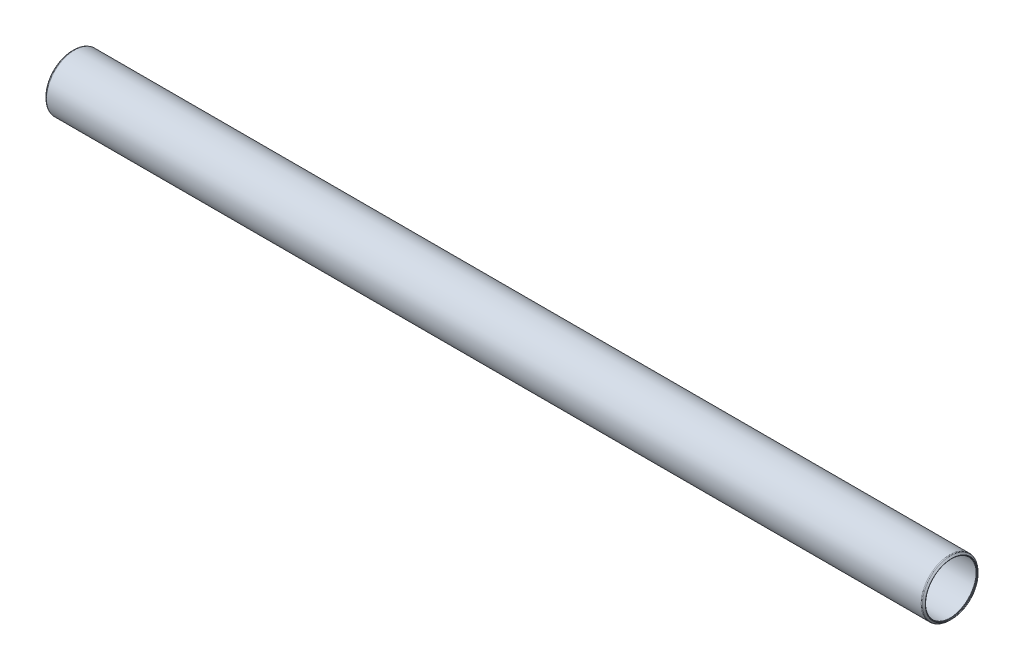
ISO-10303-21;
HEADER;
FILE_DESCRIPTION(('STEP AP214'),'2;1');
FILE_NAME('part.step','',(''),(''),'','','');
FILE_SCHEMA(('AUTOMOTIVE_DESIGN { 1 0 10303 214 1 1 1 1 }'));
ENDSEC;
DATA;
#1=APPLICATION_CONTEXT('core data for automotive mechanical design processes');
#2=APPLICATION_PROTOCOL_DEFINITION('international standard','automotive_design',2000,#1);
#3=PRODUCT_CONTEXT('',#1,'mechanical');
#4=PRODUCT('Part','Part','',(#3));
#5=PRODUCT_RELATED_PRODUCT_CATEGORY('part','',(#4));
#6=PRODUCT_DEFINITION_FORMATION('','',#4);
#7=PRODUCT_DEFINITION_CONTEXT('part definition',#1,'design');
#8=PRODUCT_DEFINITION('design','',#6,#7);
#9=PRODUCT_DEFINITION_SHAPE('','',#8);
#10=(LENGTH_UNIT() NAMED_UNIT(*) SI_UNIT(.MILLI.,.METRE.));
#11=(NAMED_UNIT(*) PLANE_ANGLE_UNIT() SI_UNIT($,.RADIAN.));
#12=(NAMED_UNIT(*) SI_UNIT($,.STERADIAN.) SOLID_ANGLE_UNIT());
#13=UNCERTAINTY_MEASURE_WITH_UNIT(LENGTH_MEASURE(1.E-05),#10,'distance_accuracy_value','');
#14=(GEOMETRIC_REPRESENTATION_CONTEXT(3) GLOBAL_UNCERTAINTY_ASSIGNED_CONTEXT((#13)) GLOBAL_UNIT_ASSIGNED_CONTEXT((#10,
#11,#12)) REPRESENTATION_CONTEXT('',''));
#15=CARTESIAN_POINT('',(0.,0.,0.));
#16=DIRECTION('',(0.,0.,1.));
#17=DIRECTION('',(1.,0.,0.));
#18=AXIS2_PLACEMENT_3D('',#15,#16,#17);
#19=CARTESIAN_POINT('',(364.91545,0.,0.));
#20=DIRECTION('',(-1.,0.,0.));
#21=DIRECTION('',(0.,0.,1.));
#22=AXIS2_PLACEMENT_3D('',#19,#20,#21);
#23=CYLINDRICAL_SURFACE('',#22,22.39645);
#24=CARTESIAN_POINT('',(-363.86135,0.,0.));
#25=DIRECTION('',(1.,0.,0.));
#26=DIRECTION('',(0.,0.,-1.));
#27=AXIS2_PLACEMENT_3D('',#24,#25,#26);
#28=CIRCLE('',#27,22.39645);
#29=CARTESIAN_POINT('',(-363.86135,0.,-22.39645));
#30=VERTEX_POINT('',#29);
#31=EDGE_CURVE('E88',#30,#30,#28,.F.);
#32=ORIENTED_EDGE('',*,*,#31,.T.);
#33=EDGE_LOOP('',(#32));
#34=FACE_BOUND('',#33,.T.);
#35=CARTESIAN_POINT('',(363.86135,0.,0.));
#36=DIRECTION('',(-1.,0.,0.));
#37=DIRECTION('',(0.,0.,1.));
#38=AXIS2_PLACEMENT_3D('',#35,#36,#37);
#39=CIRCLE('',#38,22.39645);
#40=CARTESIAN_POINT('',(363.86135,0.,22.39645));
#41=VERTEX_POINT('',#40);
#42=EDGE_CURVE('E17',#41,#41,#39,.F.);
#43=ORIENTED_EDGE('',*,*,#42,.T.);
#44=EDGE_LOOP('',(#43));
#45=FACE_BOUND('',#44,.T.);
#46=ADVANCED_FACE('F14',(#34,#45),#23,.F.);
#47=CARTESIAN_POINT('',(363.86135,0.,0.));
#48=DIRECTION('',(-1.,0.,0.));
#49=DIRECTION('',(0.,0.,1.));
#50=AXIS2_PLACEMENT_3D('',#47,#48,#49);
#51=CONICAL_SURFACE('',#50,22.39645,0.785398163397473);
#52=CARTESIAN_POINT('',(364.91545,0.,0.));
#53=DIRECTION('',(-1.,0.,0.));
#54=DIRECTION('',(0.,0.,1.));
#55=AXIS2_PLACEMENT_3D('',#52,#53,#54);
#56=CIRCLE('',#55,21.34235);
#57=CARTESIAN_POINT('',(364.91545,0.,21.34235));
#58=VERTEX_POINT('',#57);
#59=EDGE_CURVE('E86',#58,#58,#56,.F.);
#60=ORIENTED_EDGE('',*,*,#59,.T.);
#61=EDGE_LOOP('',(#60));
#62=FACE_BOUND('',#61,.T.);
#63=ORIENTED_EDGE('',*,*,#42,.F.);
#64=EDGE_LOOP('',(#63));
#65=FACE_BOUND('',#64,.T.);
#66=ADVANCED_FACE('F96',(#62,#65),#51,.F.);
#67=CARTESIAN_POINT('',(-363.86135,0.,0.));
#68=DIRECTION('',(1.,0.,0.));
#69=DIRECTION('',(0.,1.,0.));
#70=AXIS2_PLACEMENT_3D('',#67,#68,#69);
#71=CONICAL_SURFACE('',#70,22.39645,0.785398163397473);
#72=CARTESIAN_POINT('',(-364.91545,0.,0.));
#73=DIRECTION('',(-1.,0.,0.));
#74=DIRECTION('',(0.,0.,1.));
#75=AXIS2_PLACEMENT_3D('',#72,#73,#74);
#76=CIRCLE('',#75,21.34235);
#77=CARTESIAN_POINT('',(-364.91545,0.,21.34235));
#78=VERTEX_POINT('',#77);
#79=EDGE_CURVE('E83',#78,#78,#76,.T.);
#80=ORIENTED_EDGE('',*,*,#79,.T.);
#81=EDGE_LOOP('',(#80));
#82=FACE_BOUND('',#81,.T.);
#83=ORIENTED_EDGE('',*,*,#31,.F.);
#84=EDGE_LOOP('',(#83));
#85=FACE_BOUND('',#84,.T.);
#86=ADVANCED_FACE('F98',(#82,#85),#71,.F.);
#87=CARTESIAN_POINT('',(364.91545,0.,0.));
#88=DIRECTION('',(-1.,0.,0.));
#89=DIRECTION('',(0.,0.,1.));
#90=AXIS2_PLACEMENT_3D('',#87,#88,#89);
#91=CYLINDRICAL_SURFACE('',#90,21.34235);
#92=ORIENTED_EDGE('',*,*,#59,.F.);
#93=EDGE_LOOP('',(#92));
#94=FACE_BOUND('',#93,.T.);
#95=CARTESIAN_POINT('',(365.4425,0.,0.));
#96=DIRECTION('',(1.,0.,0.));
#97=DIRECTION('',(0.,0.,-1.));
#98=AXIS2_PLACEMENT_3D('',#95,#96,#97);
#99=CIRCLE('',#98,21.34235);
#100=CARTESIAN_POINT('',(365.4425,0.,-21.34235));
#101=VERTEX_POINT('',#100);
#102=EDGE_CURVE('E80',#101,#101,#99,.T.);
#103=ORIENTED_EDGE('',*,*,#102,.T.);
#104=EDGE_LOOP('',(#103));
#105=FACE_BOUND('',#104,.T.);
#106=ADVANCED_FACE('F105',(#94,#105),#91,.F.);
#107=CARTESIAN_POINT('',(364.91545,0.,0.));
#108=DIRECTION('',(-1.,0.,0.));
#109=DIRECTION('',(0.,0.,1.));
#110=AXIS2_PLACEMENT_3D('',#107,#108,#109);
#111=CYLINDRICAL_SURFACE('',#110,21.34235);
#112=CARTESIAN_POINT('',(-365.4425,0.,0.));
#113=DIRECTION('',(-1.,0.,0.));
#114=DIRECTION('',(0.,0.,1.));
#115=AXIS2_PLACEMENT_3D('',#112,#113,#114);
#116=CIRCLE('',#115,21.34235);
#117=CARTESIAN_POINT('',(-365.4425,0.,21.34235));
#118=VERTEX_POINT('',#117);
#119=EDGE_CURVE('E77',#118,#118,#116,.T.);
#120=ORIENTED_EDGE('',*,*,#119,.T.);
#121=EDGE_LOOP('',(#120));
#122=FACE_BOUND('',#121,.T.);
#123=ORIENTED_EDGE('',*,*,#79,.F.);
#124=EDGE_LOOP('',(#123));
#125=FACE_BOUND('',#124,.T.);
#126=ADVANCED_FACE('F157',(#122,#125),#111,.F.);
#127=CARTESIAN_POINT('',(365.834533696838,0.,0.));
#128=DIRECTION('',(1.,0.,0.));
#129=DIRECTION('',(0.,0.,-1.));
#130=AXIS2_PLACEMENT_3D('',#127,#128,#129);
#131=CONICAL_SURFACE('',#130,21.7343836968381,0.785398163397316);
#132=ORIENTED_EDGE('',*,*,#102,.F.);
#133=EDGE_LOOP('',(#132));
#134=FACE_BOUND('',#133,.T.);
#135=CARTESIAN_POINT('',(365.834533696838,0.,0.));
#136=DIRECTION('',(1.,0.,0.));
#137=DIRECTION('',(0.,0.,-1.));
#138=AXIS2_PLACEMENT_3D('',#135,#136,#137);
#139=CIRCLE('',#138,21.7343836968381);
#140=CARTESIAN_POINT('',(365.834533696838,0.,-21.7343836968381));
#141=VERTEX_POINT('',#140);
#142=EDGE_CURVE('E74',#141,#141,#139,.F.);
#143=ORIENTED_EDGE('',*,*,#142,.F.);
#144=EDGE_LOOP('',(#143));
#145=FACE_BOUND('',#144,.T.);
#146=ADVANCED_FACE('F150',(#134,#145),#131,.F.);
#147=CARTESIAN_POINT('',(-365.834533696838,0.,0.));
#148=DIRECTION('',(-1.,0.,0.));
#149=DIRECTION('',(0.,0.,1.));
#150=AXIS2_PLACEMENT_3D('',#147,#148,#149);
#151=CONICAL_SURFACE('',#150,21.734383696838,0.785398163397453);
#152=ORIENTED_EDGE('',*,*,#119,.F.);
#153=EDGE_LOOP('',(#152));
#154=FACE_BOUND('',#153,.T.);
#155=CARTESIAN_POINT('',(-365.834533696838,0.,0.));
#156=DIRECTION('',(1.,0.,0.));
#157=DIRECTION('',(0.,0.,-1.));
#158=AXIS2_PLACEMENT_3D('',#155,#156,#157);
#159=CIRCLE('',#158,21.734383696838);
#160=CARTESIAN_POINT('',(-365.834533696838,0.,-21.734383696838));
#161=VERTEX_POINT('',#160);
#162=EDGE_CURVE('E56',#161,#161,#159,.T.);
#163=ORIENTED_EDGE('',*,*,#162,.F.);
#164=EDGE_LOOP('',(#163));
#165=FACE_BOUND('',#164,.T.);
#166=ADVANCED_FACE('F69',(#154,#165),#151,.F.);
#167=CARTESIAN_POINT('',(365.744731135627,0.,0.));
#168=DIRECTION('',(1.,0.,0.));
#169=DIRECTION('',(0.,0.,-1.));
#170=AXIS2_PLACEMENT_3D('',#167,#168,#169);
#171=TOROIDAL_SURFACE('',#170,21.8241862580487,0.127000000000171);
#172=ORIENTED_EDGE('',*,*,#142,.T.);
#173=EDGE_LOOP('',(#172));
#174=FACE_BOUND('',#173,.T.);
#175=CARTESIAN_POINT('',(365.834533696838,0.,0.));
#176=DIRECTION('',(-1.,0.,0.));
#177=DIRECTION('',(0.,0.,1.));
#178=AXIS2_PLACEMENT_3D('',#175,#176,#177);
#179=CIRCLE('',#178,21.9139888192594);
#180=CARTESIAN_POINT('',(365.834533696838,0.,21.9139888192594));
#181=VERTEX_POINT('',#180);
#182=EDGE_CURVE('E53',#181,#181,#179,.T.);
#183=ORIENTED_EDGE('',*,*,#182,.F.);
#184=EDGE_LOOP('',(#183));
#185=FACE_BOUND('',#184,.T.);
#186=ADVANCED_FACE('F65',(#174,#185),#171,.T.);
#187=CARTESIAN_POINT('',(-365.744731135627,0.,0.));
#188=DIRECTION('',(1.,0.,0.));
#189=DIRECTION('',(0.,0.,-1.));
#190=AXIS2_PLACEMENT_3D('',#187,#188,#189);
#191=TOROIDAL_SURFACE('',#190,21.8241862580487,0.127000000000003);
#192=CARTESIAN_POINT('',(-365.834533696838,0.,0.));
#193=DIRECTION('',(1.,0.,0.));
#194=DIRECTION('',(0.,0.,-1.));
#195=AXIS2_PLACEMENT_3D('',#192,#193,#194);
#196=CIRCLE('',#195,21.9139888192594);
#197=CARTESIAN_POINT('',(-365.834533696838,0.,-21.9139888192594));
#198=VERTEX_POINT('',#197);
#199=EDGE_CURVE('E50',#198,#198,#196,.T.);
#200=ORIENTED_EDGE('',*,*,#199,.F.);
#201=EDGE_LOOP('',(#200));
#202=FACE_BOUND('',#201,.T.);
#203=ORIENTED_EDGE('',*,*,#162,.T.);
#204=EDGE_LOOP('',(#203));
#205=FACE_BOUND('',#204,.T.);
#206=ADVANCED_FACE('F61',(#202,#205),#191,.T.);
#207=CARTESIAN_POINT('',(364.632111258049,0.,0.));
#208=DIRECTION('',(-1.,0.,0.));
#209=DIRECTION('',(0.,0.,1.));
#210=AXIS2_PLACEMENT_3D('',#207,#208,#209);
#211=CONICAL_SURFACE('',#210,23.1164112580488,0.785398163397409);
#212=CARTESIAN_POINT('',(364.632111258049,0.,0.));
#213=DIRECTION('',(1.,0.,0.));
#214=DIRECTION('',(0.,0.,-1.));
#215=AXIS2_PLACEMENT_3D('',#212,#213,#214);
#216=CIRCLE('',#215,23.1164112580488);
#217=CARTESIAN_POINT('',(364.632111258049,0.,-23.1164112580488));
#218=VERTEX_POINT('',#217);
#219=EDGE_CURVE('E47',#218,#218,#216,.F.);
#220=ORIENTED_EDGE('',*,*,#219,.F.);
#221=EDGE_LOOP('',(#220));
#222=FACE_BOUND('',#221,.T.);
#223=ORIENTED_EDGE('',*,*,#182,.T.);
#224=EDGE_LOOP('',(#223));
#225=FACE_BOUND('',#224,.T.);
#226=ADVANCED_FACE('F64',(#222,#225),#211,.T.);
#227=CARTESIAN_POINT('',(-364.632111258049,0.,0.));
#228=DIRECTION('',(1.,0.,0.));
#229=DIRECTION('',(0.,1.,0.));
#230=AXIS2_PLACEMENT_3D('',#227,#228,#229);
#231=CONICAL_SURFACE('',#230,23.1164112580487,0.785398163397444);
#232=CARTESIAN_POINT('',(-364.632111258049,0.,0.));
#233=DIRECTION('',(1.,0.,0.));
#234=DIRECTION('',(0.,0.,-1.));
#235=AXIS2_PLACEMENT_3D('',#232,#233,#234);
#236=CIRCLE('',#235,23.1164112580488);
#237=CARTESIAN_POINT('',(-364.632111258049,0.,-23.1164112580488));
#238=VERTEX_POINT('',#237);
#239=EDGE_CURVE('E26',#238,#238,#236,.T.);
#240=ORIENTED_EDGE('',*,*,#239,.F.);
#241=EDGE_LOOP('',(#240));
#242=FACE_BOUND('',#241,.T.);
#243=ORIENTED_EDGE('',*,*,#199,.T.);
#244=EDGE_LOOP('',(#243));
#245=FACE_BOUND('',#244,.T.);
#246=ADVANCED_FACE('F42',(#242,#245),#231,.T.);
#247=CARTESIAN_POINT('',(363.88675,0.,0.));
#248=DIRECTION('',(1.,0.,0.));
#249=DIRECTION('',(0.,0.,-1.));
#250=AXIS2_PLACEMENT_3D('',#247,#248,#249);
#251=TOROIDAL_SURFACE('',#250,22.3710500000007,1.0540999999992);
#252=ORIENTED_EDGE('',*,*,#219,.T.);
#253=EDGE_LOOP('',(#252));
#254=FACE_BOUND('',#253,.T.);
#255=CARTESIAN_POINT('',(363.88675,0.,0.));
#256=DIRECTION('',(-1.,0.,0.));
#257=DIRECTION('',(0.,0.,1.));
#258=AXIS2_PLACEMENT_3D('',#255,#256,#257);
#259=CIRCLE('',#258,23.4251499999999);
#260=CARTESIAN_POINT('',(363.88675,0.,23.4251499999999));
#261=VERTEX_POINT('',#260);
#262=EDGE_CURVE('E21',#261,#261,#259,.T.);
#263=ORIENTED_EDGE('',*,*,#262,.F.);
#264=EDGE_LOOP('',(#263));
#265=FACE_BOUND('',#264,.T.);
#266=ADVANCED_FACE('F38',(#254,#265),#251,.T.);
#267=CARTESIAN_POINT('',(-363.88675,0.,0.));
#268=DIRECTION('',(1.,0.,0.));
#269=DIRECTION('',(0.,0.,-1.));
#270=AXIS2_PLACEMENT_3D('',#267,#268,#269);
#271=TOROIDAL_SURFACE('',#270,22.37105,1.05409999999998);
#272=CARTESIAN_POINT('',(-363.88675,0.,0.));
#273=DIRECTION('',(-1.,0.,0.));
#274=DIRECTION('',(0.,0.,1.));
#275=AXIS2_PLACEMENT_3D('',#272,#273,#274);
#276=CIRCLE('',#275,23.4251499999999);
#277=CARTESIAN_POINT('',(-363.88675,0.,23.4251499999999));
#278=VERTEX_POINT('',#277);
#279=EDGE_CURVE('E9',#278,#278,#276,.F.);
#280=ORIENTED_EDGE('',*,*,#279,.F.);
#281=EDGE_LOOP('',(#280));
#282=FACE_BOUND('',#281,.T.);
#283=ORIENTED_EDGE('',*,*,#239,.T.);
#284=EDGE_LOOP('',(#283));
#285=FACE_BOUND('',#284,.T.);
#286=ADVANCED_FACE('F33',(#282,#285),#271,.T.);
#287=CARTESIAN_POINT('',(364.91545,0.,0.));
#288=DIRECTION('',(-1.,0.,0.));
#289=DIRECTION('',(0.,0.,1.));
#290=AXIS2_PLACEMENT_3D('',#287,#288,#289);
#291=CYLINDRICAL_SURFACE('',#290,23.4251499999999);
#292=ORIENTED_EDGE('',*,*,#262,.T.);
#293=EDGE_LOOP('',(#292));
#294=FACE_BOUND('',#293,.T.);
#295=ORIENTED_EDGE('',*,*,#279,.T.);
#296=EDGE_LOOP('',(#295));
#297=FACE_BOUND('',#296,.T.);
#298=ADVANCED_FACE('F37',(#294,#297),#291,.T.);
#299=CLOSED_SHELL('',(#46,#66,#86,#106,#126,#146,#166,#186,#206,#226,#246,#266,#286,#298));
#300=MANIFOLD_SOLID_BREP('B1',#299);
#301=ADVANCED_BREP_SHAPE_REPRESENTATION('',(#18,#300),#14);
#302=SHAPE_DEFINITION_REPRESENTATION(#9,#301);
ENDSEC;
END-ISO-10303-21;
